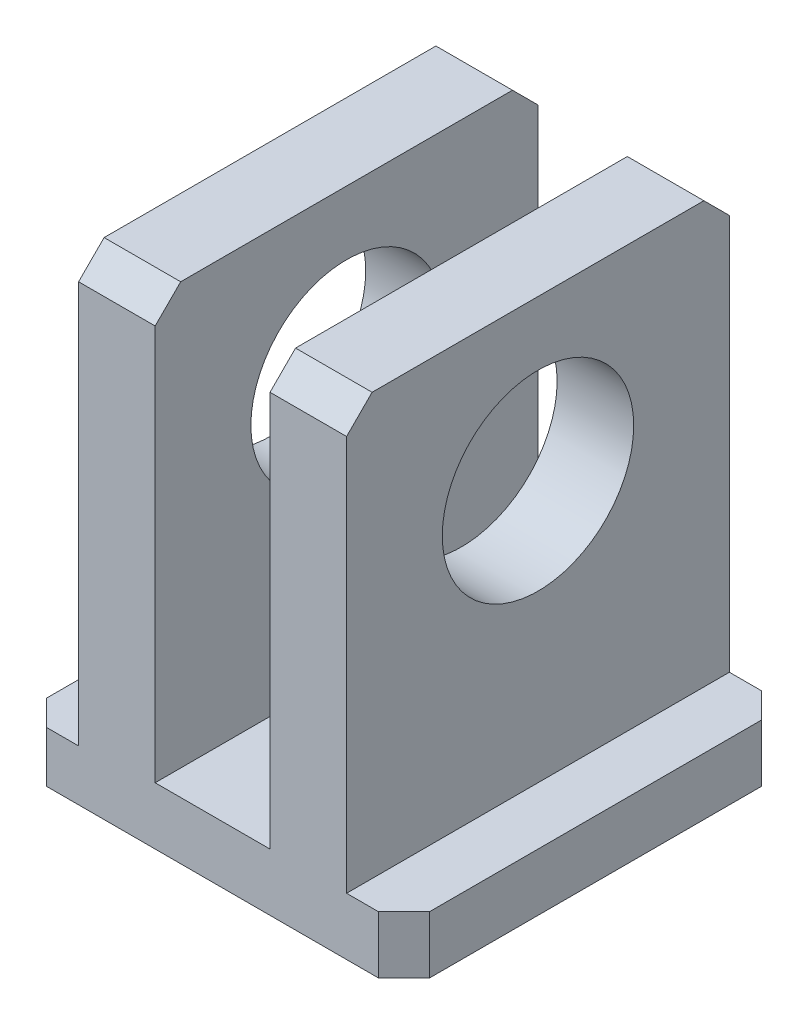
ISO-10303-21;
HEADER;
FILE_DESCRIPTION(('STEP AP214'),'2;1');
FILE_NAME('part.step','',(''),(''),'','','');
FILE_SCHEMA(('AUTOMOTIVE_DESIGN { 1 0 10303 214 1 1 1 1 }'));
ENDSEC;
DATA;
#1=APPLICATION_CONTEXT('core data for automotive mechanical design processes');
#2=APPLICATION_PROTOCOL_DEFINITION('international standard','automotive_design',2000,#1);
#3=PRODUCT_CONTEXT('',#1,'mechanical');
#4=PRODUCT('Part','Part','',(#3));
#5=PRODUCT_RELATED_PRODUCT_CATEGORY('part','',(#4));
#6=PRODUCT_DEFINITION_FORMATION('','',#4);
#7=PRODUCT_DEFINITION_CONTEXT('part definition',#1,'design');
#8=PRODUCT_DEFINITION('design','',#6,#7);
#9=PRODUCT_DEFINITION_SHAPE('','',#8);
#10=(LENGTH_UNIT() NAMED_UNIT(*) SI_UNIT(.MILLI.,.METRE.));
#11=(NAMED_UNIT(*) PLANE_ANGLE_UNIT() SI_UNIT($,.RADIAN.));
#12=(NAMED_UNIT(*) SI_UNIT($,.STERADIAN.) SOLID_ANGLE_UNIT());
#13=UNCERTAINTY_MEASURE_WITH_UNIT(LENGTH_MEASURE(1.E-05),#10,'distance_accuracy_value','');
#14=(GEOMETRIC_REPRESENTATION_CONTEXT(3) GLOBAL_UNCERTAINTY_ASSIGNED_CONTEXT((#13)) GLOBAL_UNIT_ASSIGNED_CONTEXT((#10,
#11,#12)) REPRESENTATION_CONTEXT('',''));
#15=CARTESIAN_POINT('',(0.,0.,0.));
#16=DIRECTION('',(0.,0.,1.));
#17=DIRECTION('',(1.,0.,0.));
#18=AXIS2_PLACEMENT_3D('',#15,#16,#17);
#19=CARTESIAN_POINT('',(-13.,37.5,15.));
#20=DIRECTION('',(0.,0.,-1.));
#21=DIRECTION('',(-1.,0.,0.));
#22=AXIS2_PLACEMENT_3D('',#19,#20,#21);
#23=PLANE('',#22);
#24=DIRECTION('',(0.,1.,0.));
#25=VECTOR('',#24,1.);
#26=CARTESIAN_POINT('',(10.5,4.5,15.));
#27=LINE('',#26,#25);
#28=CARTESIAN_POINT('',(10.5,4.5,15.));
#29=VERTEX_POINT('',#28);
#30=CARTESIAN_POINT('',(10.5,35.5,15.));
#31=VERTEX_POINT('',#30);
#32=EDGE_CURVE('E247',#29,#31,#27,.T.);
#33=ORIENTED_EDGE('',*,*,#32,.T.);
#34=DIRECTION('',(-1.,0.,0.));
#35=VECTOR('',#34,1.);
#36=CARTESIAN_POINT('',(-13.,35.5,15.));
#37=LINE('',#36,#35);
#38=CARTESIAN_POINT('',(4.5,35.5,15.));
#39=VERTEX_POINT('',#38);
#40=EDGE_CURVE('E328',#31,#39,#37,.T.);
#41=ORIENTED_EDGE('',*,*,#40,.T.);
#42=DIRECTION('',(0.,1.,0.));
#43=VECTOR('',#42,1.);
#44=CARTESIAN_POINT('',(4.5,4.5,15.));
#45=LINE('',#44,#43);
#46=CARTESIAN_POINT('',(4.5,4.5,15.));
#47=VERTEX_POINT('',#46);
#48=EDGE_CURVE('E206',#47,#39,#45,.T.);
#49=ORIENTED_EDGE('',*,*,#48,.F.);
#50=DIRECTION('',(-1.,0.,0.));
#51=VECTOR('',#50,1.);
#52=CARTESIAN_POINT('',(4.5,4.5,15.));
#53=LINE('',#52,#51);
#54=CARTESIAN_POINT('',(-4.5,4.5,15.));
#55=VERTEX_POINT('',#54);
#56=EDGE_CURVE('E185',#47,#55,#53,.T.);
#57=ORIENTED_EDGE('',*,*,#56,.T.);
#58=DIRECTION('',(0.,1.,0.));
#59=VECTOR('',#58,1.);
#60=CARTESIAN_POINT('',(-4.5,4.5,15.));
#61=LINE('',#60,#59);
#62=CARTESIAN_POINT('',(-4.5,35.5,15.));
#63=VERTEX_POINT('',#62);
#64=EDGE_CURVE('E194',#55,#63,#61,.T.);
#65=ORIENTED_EDGE('',*,*,#64,.T.);
#66=DIRECTION('',(-1.,0.,0.));
#67=VECTOR('',#66,1.);
#68=CARTESIAN_POINT('',(-13.,35.5,15.));
#69=LINE('',#68,#67);
#70=CARTESIAN_POINT('',(-10.5,35.5,15.));
#71=VERTEX_POINT('',#70);
#72=EDGE_CURVE('E326',#63,#71,#69,.T.);
#73=ORIENTED_EDGE('',*,*,#72,.T.);
#74=DIRECTION('',(0.,1.,0.));
#75=VECTOR('',#74,1.);
#76=CARTESIAN_POINT('',(-10.5,4.,15.));
#77=LINE('',#76,#75);
#78=CARTESIAN_POINT('',(-10.5,4.,15.));
#79=VERTEX_POINT('',#78);
#80=EDGE_CURVE('E267',#79,#71,#77,.T.);
#81=ORIENTED_EDGE('',*,*,#80,.F.);
#82=DIRECTION('',(1.,0.,0.));
#83=VECTOR('',#82,1.);
#84=CARTESIAN_POINT('',(-13.,4.,15.));
#85=LINE('',#84,#83);
#86=CARTESIAN_POINT('',(-13.,4.,15.));
#87=VERTEX_POINT('',#86);
#88=EDGE_CURVE('E264',#87,#79,#85,.T.);
#89=ORIENTED_EDGE('',*,*,#88,.F.);
#90=DIRECTION('',(0.,-1.,0.));
#91=VECTOR('',#90,1.);
#92=CARTESIAN_POINT('',(-13.,37.5,15.));
#93=LINE('',#92,#91);
#94=CARTESIAN_POINT('',(-13.,0.,15.));
#95=VERTEX_POINT('',#94);
#96=EDGE_CURVE('E303',#87,#95,#93,.T.);
#97=ORIENTED_EDGE('',*,*,#96,.T.);
#98=DIRECTION('',(1.,0.,0.));
#99=VECTOR('',#98,1.);
#100=CARTESIAN_POINT('',(-13.,0.,15.));
#101=LINE('',#100,#99);
#102=CARTESIAN_POINT('',(13.,0.,15.));
#103=VERTEX_POINT('',#102);
#104=EDGE_CURVE('E288',#95,#103,#101,.T.);
#105=ORIENTED_EDGE('',*,*,#104,.T.);
#106=DIRECTION('',(0.,-1.,0.));
#107=VECTOR('',#106,1.);
#108=CARTESIAN_POINT('',(13.,37.5,15.));
#109=LINE('',#108,#107);
#110=CARTESIAN_POINT('',(13.,4.5,15.));
#111=VERTEX_POINT('',#110);
#112=EDGE_CURVE('E305',#111,#103,#109,.T.);
#113=ORIENTED_EDGE('',*,*,#112,.F.);
#114=DIRECTION('',(-1.,0.,0.));
#115=VECTOR('',#114,1.);
#116=CARTESIAN_POINT('',(13.,4.5,15.));
#117=LINE('',#116,#115);
#118=EDGE_CURVE('E237',#111,#29,#117,.T.);
#119=ORIENTED_EDGE('',*,*,#118,.T.);
#120=EDGE_LOOP('',(#33,#41,#49,#57,#65,#73,#81,#89,#97,#105,#113,#119));
#121=FACE_BOUND('',#120,.T.);
#122=ADVANCED_FACE('F43',(#121),#23,.F.);
#123=CARTESIAN_POINT('',(-13.,37.5,-15.));
#124=DIRECTION('',(0.,0.,-1.));
#125=DIRECTION('',(-1.,0.,0.));
#126=AXIS2_PLACEMENT_3D('',#123,#124,#125);
#127=PLANE('',#126);
#128=DIRECTION('',(0.,1.,0.));
#129=VECTOR('',#128,1.);
#130=CARTESIAN_POINT('',(4.5,4.5,-15.));
#131=LINE('',#130,#129);
#132=CARTESIAN_POINT('',(4.5,4.5,-15.));
#133=VERTEX_POINT('',#132);
#134=CARTESIAN_POINT('',(4.5,35.5,-15.));
#135=VERTEX_POINT('',#134);
#136=EDGE_CURVE('E221',#133,#135,#131,.T.);
#137=ORIENTED_EDGE('',*,*,#136,.T.);
#138=DIRECTION('',(1.,0.,0.));
#139=VECTOR('',#138,1.);
#140=CARTESIAN_POINT('',(10.5,35.5,-15.));
#141=LINE('',#140,#139);
#142=CARTESIAN_POINT('',(10.5,35.5,-15.));
#143=VERTEX_POINT('',#142);
#144=EDGE_CURVE('E337',#135,#143,#141,.T.);
#145=ORIENTED_EDGE('',*,*,#144,.T.);
#146=DIRECTION('',(0.,1.,0.));
#147=VECTOR('',#146,1.);
#148=CARTESIAN_POINT('',(10.5,4.5,-15.));
#149=LINE('',#148,#147);
#150=CARTESIAN_POINT('',(10.5,4.5,-15.));
#151=VERTEX_POINT('',#150);
#152=EDGE_CURVE('E242',#151,#143,#149,.T.);
#153=ORIENTED_EDGE('',*,*,#152,.F.);
#154=DIRECTION('',(1.,0.,0.));
#155=VECTOR('',#154,1.);
#156=CARTESIAN_POINT('',(10.5,4.5,-15.));
#157=LINE('',#156,#155);
#158=CARTESIAN_POINT('',(13.,4.5,-15.));
#159=VERTEX_POINT('',#158);
#160=EDGE_CURVE('E225',#151,#159,#157,.T.);
#161=ORIENTED_EDGE('',*,*,#160,.T.);
#162=DIRECTION('',(0.,-1.,0.));
#163=VECTOR('',#162,1.);
#164=CARTESIAN_POINT('',(13.,37.5,-15.));
#165=LINE('',#164,#163);
#166=CARTESIAN_POINT('',(13.,0.,-15.));
#167=VERTEX_POINT('',#166);
#168=EDGE_CURVE('E311',#159,#167,#165,.T.);
#169=ORIENTED_EDGE('',*,*,#168,.T.);
#170=DIRECTION('',(1.,0.,0.));
#171=VECTOR('',#170,1.);
#172=CARTESIAN_POINT('',(-13.,0.,-15.));
#173=LINE('',#172,#171);
#174=CARTESIAN_POINT('',(-13.,0.,-15.));
#175=VERTEX_POINT('',#174);
#176=EDGE_CURVE('E276',#175,#167,#173,.T.);
#177=ORIENTED_EDGE('',*,*,#176,.F.);
#178=DIRECTION('',(0.,-1.,0.));
#179=VECTOR('',#178,1.);
#180=CARTESIAN_POINT('',(-13.,37.5,-15.));
#181=LINE('',#180,#179);
#182=CARTESIAN_POINT('',(-13.,4.,-15.));
#183=VERTEX_POINT('',#182);
#184=EDGE_CURVE('E297',#183,#175,#181,.T.);
#185=ORIENTED_EDGE('',*,*,#184,.F.);
#186=DIRECTION('',(1.,0.,0.));
#187=VECTOR('',#186,1.);
#188=CARTESIAN_POINT('',(-13.,4.,-15.));
#189=LINE('',#188,#187);
#190=CARTESIAN_POINT('',(-10.5,4.,-15.));
#191=VERTEX_POINT('',#190);
#192=EDGE_CURVE('E258',#183,#191,#189,.T.);
#193=ORIENTED_EDGE('',*,*,#192,.T.);
#194=DIRECTION('',(0.,1.,0.));
#195=VECTOR('',#194,1.);
#196=CARTESIAN_POINT('',(-10.5,4.,-15.));
#197=LINE('',#196,#195);
#198=CARTESIAN_POINT('',(-10.5,35.5,-15.));
#199=VERTEX_POINT('',#198);
#200=EDGE_CURVE('E270',#191,#199,#197,.T.);
#201=ORIENTED_EDGE('',*,*,#200,.T.);
#202=DIRECTION('',(1.,0.,0.));
#203=VECTOR('',#202,1.);
#204=CARTESIAN_POINT('',(-4.5,35.5,-15.));
#205=LINE('',#204,#203);
#206=CARTESIAN_POINT('',(-4.5,35.5,-15.));
#207=VERTEX_POINT('',#206);
#208=EDGE_CURVE('E334',#199,#207,#205,.T.);
#209=ORIENTED_EDGE('',*,*,#208,.T.);
#210=DIRECTION('',(0.,1.,0.));
#211=VECTOR('',#210,1.);
#212=CARTESIAN_POINT('',(-4.5,4.5,-15.));
#213=LINE('',#212,#211);
#214=CARTESIAN_POINT('',(-4.5,4.5,-15.));
#215=VERTEX_POINT('',#214);
#216=EDGE_CURVE('E201',#215,#207,#213,.T.);
#217=ORIENTED_EDGE('',*,*,#216,.F.);
#218=DIRECTION('',(-1.,0.,0.));
#219=VECTOR('',#218,1.);
#220=CARTESIAN_POINT('',(4.5,4.5,-15.));
#221=LINE('',#220,#219);
#222=EDGE_CURVE('E188',#133,#215,#221,.T.);
#223=ORIENTED_EDGE('',*,*,#222,.F.);
#224=EDGE_LOOP('',(#137,#145,#153,#161,#169,#177,#185,#193,#201,#209,#217,#223));
#225=FACE_BOUND('',#224,.T.);
#226=ADVANCED_FACE('F351',(#225),#127,.T.);
#227=CARTESIAN_POINT('',(0.,37.5,0.));
#228=DIRECTION('',(0.,-1.,0.));
#229=DIRECTION('',(0.,0.,-1.));
#230=AXIS2_PLACEMENT_3D('',#227,#228,#229);
#231=PLANE('',#230);
#232=DIRECTION('',(0.,0.,-1.));
#233=VECTOR('',#232,1.);
#234=CARTESIAN_POINT('',(-10.5,37.5,15.));
#235=LINE('',#234,#233);
#236=CARTESIAN_POINT('',(-10.5,37.5,13.));
#237=VERTEX_POINT('',#236);
#238=CARTESIAN_POINT('',(-10.5,37.5,-13.));
#239=VERTEX_POINT('',#238);
#240=EDGE_CURVE('E253',#237,#239,#235,.T.);
#241=ORIENTED_EDGE('',*,*,#240,.F.);
#242=DIRECTION('',(1.,0.,0.));
#243=VECTOR('',#242,1.);
#244=CARTESIAN_POINT('',(0.,37.5,13.));
#245=LINE('',#244,#243);
#246=CARTESIAN_POINT('',(-4.5,37.5,13.));
#247=VERTEX_POINT('',#246);
#248=EDGE_CURVE('E341',#237,#247,#245,.T.);
#249=ORIENTED_EDGE('',*,*,#248,.T.);
#250=DIRECTION('',(0.,0.,-1.));
#251=VECTOR('',#250,1.);
#252=CARTESIAN_POINT('',(-4.5,37.5,15.));
#253=LINE('',#252,#251);
#254=CARTESIAN_POINT('',(-4.5,37.5,-13.));
#255=VERTEX_POINT('',#254);
#256=EDGE_CURVE('E210',#247,#255,#253,.T.);
#257=ORIENTED_EDGE('',*,*,#256,.T.);
#258=DIRECTION('',(-1.,0.,0.));
#259=VECTOR('',#258,1.);
#260=CARTESIAN_POINT('',(-10.5,37.5,-13.));
#261=LINE('',#260,#259);
#262=EDGE_CURVE('E59',#255,#239,#261,.T.);
#263=ORIENTED_EDGE('',*,*,#262,.T.);
#264=EDGE_LOOP('',(#241,#249,#257,#263));
#265=FACE_BOUND('',#264,.T.);
#266=ADVANCED_FACE('F354',(#265),#231,.F.);
#267=DIRECTION('',(0.,0.,-1.));
#268=VECTOR('',#267,1.);
#269=CARTESIAN_POINT('',(4.5,37.5,15.));
#270=LINE('',#269,#268);
#271=CARTESIAN_POINT('',(4.5,37.5,13.));
#272=VERTEX_POINT('',#271);
#273=CARTESIAN_POINT('',(4.5,37.5,-13.));
#274=VERTEX_POINT('',#273);
#275=EDGE_CURVE('E207',#272,#274,#270,.T.);
#276=ORIENTED_EDGE('',*,*,#275,.F.);
#277=DIRECTION('',(1.,0.,0.));
#278=VECTOR('',#277,1.);
#279=CARTESIAN_POINT('',(0.,37.5,13.));
#280=LINE('',#279,#278);
#281=CARTESIAN_POINT('',(10.5,37.5,13.));
#282=VERTEX_POINT('',#281);
#283=EDGE_CURVE('E319',#272,#282,#280,.T.);
#284=ORIENTED_EDGE('',*,*,#283,.T.);
#285=DIRECTION('',(0.,0.,-1.));
#286=VECTOR('',#285,1.);
#287=CARTESIAN_POINT('',(10.5,37.5,15.));
#288=LINE('',#287,#286);
#289=CARTESIAN_POINT('',(10.5,37.5,-13.));
#290=VERTEX_POINT('',#289);
#291=EDGE_CURVE('E200',#282,#290,#288,.T.);
#292=ORIENTED_EDGE('',*,*,#291,.T.);
#293=DIRECTION('',(-1.,0.,0.));
#294=VECTOR('',#293,1.);
#295=CARTESIAN_POINT('',(4.5,37.5,-13.));
#296=LINE('',#295,#294);
#297=EDGE_CURVE('E300',#290,#274,#296,.T.);
#298=ORIENTED_EDGE('',*,*,#297,.T.);
#299=EDGE_LOOP('',(#276,#284,#292,#298));
#300=FACE_BOUND('',#299,.T.);
#301=ADVANCED_FACE('F404',(#300),#231,.F.);
#302=CARTESIAN_POINT('',(-15.,37.5,-13.));
#303=DIRECTION('',(-0.707106781186548,0.,-0.707106781186548));
#304=DIRECTION('',(-0.707106781186548,0.,0.707106781186548));
#305=AXIS2_PLACEMENT_3D('',#302,#303,#304);
#306=PLANE('',#305);
#307=DIRECTION('',(0.,-1.,0.));
#308=VECTOR('',#307,1.);
#309=CARTESIAN_POINT('',(-15.,37.5,-13.));
#310=LINE('',#309,#308);
#311=CARTESIAN_POINT('',(-15.,4.,-13.));
#312=VERTEX_POINT('',#311);
#313=CARTESIAN_POINT('',(-15.,0.,-13.));
#314=VERTEX_POINT('',#313);
#315=EDGE_CURVE('E298',#312,#314,#310,.T.);
#316=ORIENTED_EDGE('',*,*,#315,.F.);
#317=DIRECTION('',(0.707106781186548,0.,-0.707106781186548));
#318=VECTOR('',#317,1.);
#319=CARTESIAN_POINT('',(-13.,4.,-15.));
#320=LINE('',#319,#318);
#321=EDGE_CURVE('E249',#312,#183,#320,.T.);
#322=ORIENTED_EDGE('',*,*,#321,.T.);
#323=ORIENTED_EDGE('',*,*,#184,.T.);
#324=DIRECTION('',(0.707106781186548,0.,-0.707106781186548));
#325=VECTOR('',#324,1.);
#326=CARTESIAN_POINT('',(-15.,0.,-13.));
#327=LINE('',#326,#325);
#328=EDGE_CURVE('E273',#314,#175,#327,.T.);
#329=ORIENTED_EDGE('',*,*,#328,.F.);
#330=EDGE_LOOP('',(#316,#322,#323,#329));
#331=FACE_BOUND('',#330,.T.);
#332=ADVANCED_FACE('F433',(#331),#306,.T.);
#333=CARTESIAN_POINT('',(-15.,37.5,-13.));
#334=DIRECTION('',(1.,0.,0.));
#335=DIRECTION('',(0.,0.,-1.));
#336=AXIS2_PLACEMENT_3D('',#333,#334,#335);
#337=PLANE('',#336);
#338=DIRECTION('',(0.,-1.,0.));
#339=VECTOR('',#338,1.);
#340=CARTESIAN_POINT('',(-15.,37.5,13.));
#341=LINE('',#340,#339);
#342=CARTESIAN_POINT('',(-15.,4.,13.));
#343=VERTEX_POINT('',#342);
#344=CARTESIAN_POINT('',(-15.,0.,13.));
#345=VERTEX_POINT('',#344);
#346=EDGE_CURVE('E301',#343,#345,#341,.T.);
#347=ORIENTED_EDGE('',*,*,#346,.F.);
#348=DIRECTION('',(0.,0.,-1.));
#349=VECTOR('',#348,1.);
#350=CARTESIAN_POINT('',(-15.,4.,-13.));
#351=LINE('',#350,#349);
#352=EDGE_CURVE('E254',#343,#312,#351,.T.);
#353=ORIENTED_EDGE('',*,*,#352,.T.);
#354=ORIENTED_EDGE('',*,*,#315,.T.);
#355=DIRECTION('',(0.,0.,1.));
#356=VECTOR('',#355,1.);
#357=CARTESIAN_POINT('',(-15.,0.,-13.));
#358=LINE('',#357,#356);
#359=EDGE_CURVE('E294',#314,#345,#358,.T.);
#360=ORIENTED_EDGE('',*,*,#359,.T.);
#361=EDGE_LOOP('',(#347,#353,#354,#360));
#362=FACE_BOUND('',#361,.T.);
#363=ADVANCED_FACE('F435',(#362),#337,.F.);
#364=CARTESIAN_POINT('',(-15.,37.5,13.));
#365=DIRECTION('',(0.707106781186548,0.,-0.707106781186548));
#366=DIRECTION('',(-0.707106781186548,0.,-0.707106781186548));
#367=AXIS2_PLACEMENT_3D('',#364,#365,#366);
#368=PLANE('',#367);
#369=ORIENTED_EDGE('',*,*,#96,.F.);
#370=DIRECTION('',(-0.707106781186548,0.,-0.707106781186548));
#371=VECTOR('',#370,1.);
#372=CARTESIAN_POINT('',(-15.,4.,13.));
#373=LINE('',#372,#371);
#374=EDGE_CURVE('E250',#87,#343,#373,.T.);
#375=ORIENTED_EDGE('',*,*,#374,.T.);
#376=ORIENTED_EDGE('',*,*,#346,.T.);
#377=DIRECTION('',(0.707106781186548,0.,0.707106781186548));
#378=VECTOR('',#377,1.);
#379=CARTESIAN_POINT('',(-15.,0.,13.));
#380=LINE('',#379,#378);
#381=EDGE_CURVE('E291',#345,#95,#380,.T.);
#382=ORIENTED_EDGE('',*,*,#381,.T.);
#383=EDGE_LOOP('',(#369,#375,#376,#382));
#384=FACE_BOUND('',#383,.T.);
#385=ADVANCED_FACE('F364',(#384),#368,.F.);
#386=CARTESIAN_POINT('',(13.,37.5,15.));
#387=DIRECTION('',(-0.707106781186548,0.,-0.707106781186548));
#388=DIRECTION('',(-0.707106781186548,0.,0.707106781186548));
#389=AXIS2_PLACEMENT_3D('',#386,#387,#388);
#390=PLANE('',#389);
#391=DIRECTION('',(0.,-1.,0.));
#392=VECTOR('',#391,1.);
#393=CARTESIAN_POINT('',(15.,37.5,13.));
#394=LINE('',#393,#392);
#395=CARTESIAN_POINT('',(15.,4.5,13.));
#396=VERTEX_POINT('',#395);
#397=CARTESIAN_POINT('',(15.,0.,13.));
#398=VERTEX_POINT('',#397);
#399=EDGE_CURVE('E307',#396,#398,#394,.T.);
#400=ORIENTED_EDGE('',*,*,#399,.F.);
#401=DIRECTION('',(-0.707106781186547,0.,0.707106781186548));
#402=VECTOR('',#401,1.);
#403=CARTESIAN_POINT('',(15.,4.5,13.));
#404=LINE('',#403,#402);
#405=EDGE_CURVE('E234',#396,#111,#404,.T.);
#406=ORIENTED_EDGE('',*,*,#405,.T.);
#407=ORIENTED_EDGE('',*,*,#112,.T.);
#408=DIRECTION('',(0.707106781186548,0.,-0.707106781186548));
#409=VECTOR('',#408,1.);
#410=CARTESIAN_POINT('',(13.,0.,15.));
#411=LINE('',#410,#409);
#412=EDGE_CURVE('E285',#103,#398,#411,.T.);
#413=ORIENTED_EDGE('',*,*,#412,.T.);
#414=EDGE_LOOP('',(#400,#406,#407,#413));
#415=FACE_BOUND('',#414,.T.);
#416=ADVANCED_FACE('F375',(#415),#390,.F.);
#417=CARTESIAN_POINT('',(15.,37.5,-13.));
#418=DIRECTION('',(1.,0.,0.));
#419=DIRECTION('',(0.,0.,-1.));
#420=AXIS2_PLACEMENT_3D('',#417,#418,#419);
#421=PLANE('',#420);
#422=DIRECTION('',(0.,0.,1.));
#423=VECTOR('',#422,1.);
#424=CARTESIAN_POINT('',(15.,4.5,-13.));
#425=LINE('',#424,#423);
#426=CARTESIAN_POINT('',(15.,4.5,-13.));
#427=VERTEX_POINT('',#426);
#428=EDGE_CURVE('E231',#427,#396,#425,.T.);
#429=ORIENTED_EDGE('',*,*,#428,.T.);
#430=ORIENTED_EDGE('',*,*,#399,.T.);
#431=DIRECTION('',(0.,0.,1.));
#432=VECTOR('',#431,1.);
#433=CARTESIAN_POINT('',(15.,0.,-13.));
#434=LINE('',#433,#432);
#435=CARTESIAN_POINT('',(15.,0.,-13.));
#436=VERTEX_POINT('',#435);
#437=EDGE_CURVE('E282',#436,#398,#434,.T.);
#438=ORIENTED_EDGE('',*,*,#437,.F.);
#439=DIRECTION('',(0.,-1.,0.));
#440=VECTOR('',#439,1.);
#441=CARTESIAN_POINT('',(15.,37.5,-13.));
#442=LINE('',#441,#440);
#443=EDGE_CURVE('E309',#427,#436,#442,.T.);
#444=ORIENTED_EDGE('',*,*,#443,.F.);
#445=EDGE_LOOP('',(#429,#430,#438,#444));
#446=FACE_BOUND('',#445,.T.);
#447=ADVANCED_FACE('F382',(#446),#421,.T.);
#448=CARTESIAN_POINT('',(13.,37.5,-15.));
#449=DIRECTION('',(0.707106781186548,0.,-0.707106781186548));
#450=DIRECTION('',(-0.707106781186548,0.,-0.707106781186548));
#451=AXIS2_PLACEMENT_3D('',#448,#449,#450);
#452=PLANE('',#451);
#453=DIRECTION('',(0.707106781186548,0.,0.707106781186548));
#454=VECTOR('',#453,1.);
#455=CARTESIAN_POINT('',(13.,4.5,-15.));
#456=LINE('',#455,#454);
#457=EDGE_CURVE('E228',#159,#427,#456,.T.);
#458=ORIENTED_EDGE('',*,*,#457,.T.);
#459=ORIENTED_EDGE('',*,*,#443,.T.);
#460=DIRECTION('',(0.707106781186548,0.,0.707106781186548));
#461=VECTOR('',#460,1.);
#462=CARTESIAN_POINT('',(13.,0.,-15.));
#463=LINE('',#462,#461);
#464=EDGE_CURVE('E279',#167,#436,#463,.T.);
#465=ORIENTED_EDGE('',*,*,#464,.F.);
#466=ORIENTED_EDGE('',*,*,#168,.F.);
#467=EDGE_LOOP('',(#458,#459,#465,#466));
#468=FACE_BOUND('',#467,.T.);
#469=ADVANCED_FACE('F386',(#468),#452,.T.);
#470=CARTESIAN_POINT('',(0.,0.,0.));
#471=DIRECTION('',(0.,-1.,0.));
#472=DIRECTION('',(0.,0.,-1.));
#473=AXIS2_PLACEMENT_3D('',#470,#471,#472);
#474=PLANE('',#473);
#475=ORIENTED_EDGE('',*,*,#328,.T.);
#476=ORIENTED_EDGE('',*,*,#176,.T.);
#477=ORIENTED_EDGE('',*,*,#464,.T.);
#478=ORIENTED_EDGE('',*,*,#437,.T.);
#479=ORIENTED_EDGE('',*,*,#412,.F.);
#480=ORIENTED_EDGE('',*,*,#104,.F.);
#481=ORIENTED_EDGE('',*,*,#381,.F.);
#482=ORIENTED_EDGE('',*,*,#359,.F.);
#483=EDGE_LOOP('',(#475,#476,#477,#478,#479,#480,#481,#482));
#484=FACE_BOUND('',#483,.T.);
#485=ADVANCED_FACE('F371',(#484),#474,.T.);
#486=CARTESIAN_POINT('',(-10.5,4.,15.));
#487=DIRECTION('',(1.,0.,0.));
#488=DIRECTION('',(0.,0.,-1.));
#489=AXIS2_PLACEMENT_3D('',#486,#487,#488);
#490=PLANE('',#489);
#491=CARTESIAN_POINT('',(-10.5,25.,0.));
#492=DIRECTION('',(-1.,0.,0.));
#493=DIRECTION('',(0.,0.,1.));
#494=AXIS2_PLACEMENT_3D('',#491,#492,#493);
#495=CIRCLE('',#494,7.5);
#496=CARTESIAN_POINT('',(-10.5,25.,7.5));
#497=VERTEX_POINT('',#496);
#498=EDGE_CURVE('E472',#497,#497,#495,.T.);
#499=ORIENTED_EDGE('',*,*,#498,.F.);
#500=EDGE_LOOP('',(#499));
#501=FACE_BOUND('',#500,.T.);
#502=ORIENTED_EDGE('',*,*,#80,.T.);
#503=DIRECTION('',(0.,-0.707106781186549,0.707106781186546));
#504=VECTOR('',#503,1.);
#505=CARTESIAN_POINT('',(-10.5,37.5,13.));
#506=LINE('',#505,#504);
#507=EDGE_CURVE('E11',#71,#237,#506,.F.);
#508=ORIENTED_EDGE('',*,*,#507,.T.);
#509=ORIENTED_EDGE('',*,*,#240,.T.);
#510=DIRECTION('',(0.,-0.707106781186546,-0.707106781186549));
#511=VECTOR('',#510,1.);
#512=CARTESIAN_POINT('',(-10.5,35.5,-15.));
#513=LINE('',#512,#511);
#514=EDGE_CURVE('E52',#239,#199,#513,.T.);
#515=ORIENTED_EDGE('',*,*,#514,.T.);
#516=ORIENTED_EDGE('',*,*,#200,.F.);
#517=DIRECTION('',(0.,0.,-1.));
#518=VECTOR('',#517,1.);
#519=CARTESIAN_POINT('',(-10.5,4.,15.));
#520=LINE('',#519,#518);
#521=EDGE_CURVE('E261',#79,#191,#520,.T.);
#522=ORIENTED_EDGE('',*,*,#521,.F.);
#523=EDGE_LOOP('',(#502,#508,#509,#515,#516,#522));
#524=FACE_BOUND('',#523,.T.);
#525=ADVANCED_FACE('F347',(#501,#524),#490,.F.);
#526=CARTESIAN_POINT('',(0.,4.,0.));
#527=DIRECTION('',(0.,-1.,0.));
#528=DIRECTION('',(0.,0.,-1.));
#529=AXIS2_PLACEMENT_3D('',#526,#527,#528);
#530=PLANE('',#529);
#531=ORIENTED_EDGE('',*,*,#192,.F.);
#532=ORIENTED_EDGE('',*,*,#321,.F.);
#533=ORIENTED_EDGE('',*,*,#352,.F.);
#534=ORIENTED_EDGE('',*,*,#374,.F.);
#535=ORIENTED_EDGE('',*,*,#88,.T.);
#536=ORIENTED_EDGE('',*,*,#521,.T.);
#537=EDGE_LOOP('',(#531,#532,#533,#534,#535,#536));
#538=FACE_BOUND('',#537,.T.);
#539=ADVANCED_FACE('F361',(#538),#530,.F.);
#540=CARTESIAN_POINT('',(10.5,4.5,15.));
#541=DIRECTION('',(1.,0.,0.));
#542=DIRECTION('',(0.,0.,-1.));
#543=AXIS2_PLACEMENT_3D('',#540,#541,#542);
#544=PLANE('',#543);
#545=CARTESIAN_POINT('',(10.5,25.,0.));
#546=DIRECTION('',(1.,0.,0.));
#547=DIRECTION('',(0.,0.,-1.));
#548=AXIS2_PLACEMENT_3D('',#545,#546,#547);
#549=CIRCLE('',#548,7.5);
#550=CARTESIAN_POINT('',(10.5,25.,7.5));
#551=VERTEX_POINT('',#550);
#552=EDGE_CURVE('E317',#551,#551,#549,.F.);
#553=ORIENTED_EDGE('',*,*,#552,.T.);
#554=EDGE_LOOP('',(#553));
#555=FACE_BOUND('',#554,.T.);
#556=ORIENTED_EDGE('',*,*,#291,.F.);
#557=DIRECTION('',(0.,0.707106781186549,-0.707106781186546));
#558=VECTOR('',#557,1.);
#559=CARTESIAN_POINT('',(10.5,19.9999999999999,30.5));
#560=LINE('',#559,#558);
#561=EDGE_CURVE('E324',#282,#31,#560,.F.);
#562=ORIENTED_EDGE('',*,*,#561,.T.);
#563=ORIENTED_EDGE('',*,*,#32,.F.);
#564=DIRECTION('',(0.,0.,-1.));
#565=VECTOR('',#564,1.);
#566=CARTESIAN_POINT('',(10.5,4.5,15.));
#567=LINE('',#566,#565);
#568=EDGE_CURVE('E240',#29,#151,#567,.T.);
#569=ORIENTED_EDGE('',*,*,#568,.T.);
#570=ORIENTED_EDGE('',*,*,#152,.T.);
#571=DIRECTION('',(0.,0.707106781186546,0.707106781186549));
#572=VECTOR('',#571,1.);
#573=CARTESIAN_POINT('',(10.5,35.,-15.5));
#574=LINE('',#573,#572);
#575=EDGE_CURVE('E322',#143,#290,#574,.T.);
#576=ORIENTED_EDGE('',*,*,#575,.T.);
#577=EDGE_LOOP('',(#556,#562,#563,#569,#570,#576));
#578=FACE_BOUND('',#577,.T.);
#579=ADVANCED_FACE('F393',(#555,#578),#544,.T.);
#580=CARTESIAN_POINT('',(0.,4.5,0.));
#581=DIRECTION('',(0.,-1.,0.));
#582=DIRECTION('',(0.,0.,-1.));
#583=AXIS2_PLACEMENT_3D('',#580,#581,#582);
#584=PLANE('',#583);
#585=ORIENTED_EDGE('',*,*,#160,.F.);
#586=ORIENTED_EDGE('',*,*,#568,.F.);
#587=ORIENTED_EDGE('',*,*,#118,.F.);
#588=ORIENTED_EDGE('',*,*,#405,.F.);
#589=ORIENTED_EDGE('',*,*,#428,.F.);
#590=ORIENTED_EDGE('',*,*,#457,.F.);
#591=EDGE_LOOP('',(#585,#586,#587,#588,#589,#590));
#592=FACE_BOUND('',#591,.T.);
#593=ADVANCED_FACE('F378',(#592),#584,.F.);
#594=CARTESIAN_POINT('',(-4.5,4.5,15.));
#595=DIRECTION('',(1.,0.,0.));
#596=DIRECTION('',(0.,0.,-1.));
#597=AXIS2_PLACEMENT_3D('',#594,#595,#596);
#598=PLANE('',#597);
#599=CARTESIAN_POINT('',(-4.5,25.,0.));
#600=DIRECTION('',(1.,0.,0.));
#601=DIRECTION('',(0.,0.,-1.));
#602=AXIS2_PLACEMENT_3D('',#599,#600,#601);
#603=CIRCLE('',#602,7.5);
#604=CARTESIAN_POINT('',(-4.5,25.,7.5));
#605=VERTEX_POINT('',#604);
#606=EDGE_CURVE('E213',#605,#605,#603,.T.);
#607=ORIENTED_EDGE('',*,*,#606,.F.);
#608=EDGE_LOOP('',(#607));
#609=FACE_BOUND('',#608,.T.);
#610=ORIENTED_EDGE('',*,*,#256,.F.);
#611=DIRECTION('',(0.,0.707106781186549,-0.707106781186546));
#612=VECTOR('',#611,1.);
#613=CARTESIAN_POINT('',(-4.5,19.9999999999999,30.5));
#614=LINE('',#613,#612);
#615=EDGE_CURVE('E197',#247,#63,#614,.F.);
#616=ORIENTED_EDGE('',*,*,#615,.T.);
#617=ORIENTED_EDGE('',*,*,#64,.F.);
#618=DIRECTION('',(0.,0.,-1.));
#619=VECTOR('',#618,1.);
#620=CARTESIAN_POINT('',(-4.5,4.5,15.));
#621=LINE('',#620,#619);
#622=EDGE_CURVE('E180',#55,#215,#621,.T.);
#623=ORIENTED_EDGE('',*,*,#622,.T.);
#624=ORIENTED_EDGE('',*,*,#216,.T.);
#625=DIRECTION('',(0.,0.707106781186546,0.707106781186549));
#626=VECTOR('',#625,1.);
#627=CARTESIAN_POINT('',(-4.5,35.,-15.4999999999999));
#628=LINE('',#627,#626);
#629=EDGE_CURVE('E344',#207,#255,#628,.T.);
#630=ORIENTED_EDGE('',*,*,#629,.T.);
#631=EDGE_LOOP('',(#610,#616,#617,#623,#624,#630));
#632=FACE_BOUND('',#631,.T.);
#633=ADVANCED_FACE('F196',(#609,#632),#598,.T.);
#634=CARTESIAN_POINT('',(4.5,4.5,15.));
#635=DIRECTION('',(1.,0.,0.));
#636=DIRECTION('',(0.,0.,-1.));
#637=AXIS2_PLACEMENT_3D('',#634,#635,#636);
#638=PLANE('',#637);
#639=CARTESIAN_POINT('',(4.5,25.,0.));
#640=DIRECTION('',(1.,0.,0.));
#641=DIRECTION('',(0.,0.,-1.));
#642=AXIS2_PLACEMENT_3D('',#639,#640,#641);
#643=CIRCLE('',#642,7.5);
#644=CARTESIAN_POINT('',(4.5,25.,7.5));
#645=VERTEX_POINT('',#644);
#646=EDGE_CURVE('E314',#645,#645,#643,.T.);
#647=ORIENTED_EDGE('',*,*,#646,.T.);
#648=EDGE_LOOP('',(#647));
#649=FACE_BOUND('',#648,.T.);
#650=ORIENTED_EDGE('',*,*,#48,.T.);
#651=DIRECTION('',(0.,-0.707106781186549,0.707106781186546));
#652=VECTOR('',#651,1.);
#653=CARTESIAN_POINT('',(4.5,37.5,13.));
#654=LINE('',#653,#652);
#655=EDGE_CURVE('E332',#39,#272,#654,.F.);
#656=ORIENTED_EDGE('',*,*,#655,.T.);
#657=ORIENTED_EDGE('',*,*,#275,.T.);
#658=DIRECTION('',(0.,-0.707106781186546,-0.707106781186549));
#659=VECTOR('',#658,1.);
#660=CARTESIAN_POINT('',(4.5,35.5,-15.));
#661=LINE('',#660,#659);
#662=EDGE_CURVE('E330',#274,#135,#661,.T.);
#663=ORIENTED_EDGE('',*,*,#662,.T.);
#664=ORIENTED_EDGE('',*,*,#136,.F.);
#665=DIRECTION('',(0.,0.,-1.));
#666=VECTOR('',#665,1.);
#667=CARTESIAN_POINT('',(4.5,4.5,15.));
#668=LINE('',#667,#666);
#669=EDGE_CURVE('E217',#47,#133,#668,.T.);
#670=ORIENTED_EDGE('',*,*,#669,.F.);
#671=EDGE_LOOP('',(#650,#656,#657,#663,#664,#670));
#672=FACE_BOUND('',#671,.T.);
#673=ADVANCED_FACE('F401',(#649,#672),#638,.F.);
#674=CARTESIAN_POINT('',(0.,4.5,0.));
#675=DIRECTION('',(0.,-1.,0.));
#676=DIRECTION('',(0.,0.,-1.));
#677=AXIS2_PLACEMENT_3D('',#674,#675,#676);
#678=PLANE('',#677);
#679=ORIENTED_EDGE('',*,*,#56,.F.);
#680=ORIENTED_EDGE('',*,*,#669,.T.);
#681=ORIENTED_EDGE('',*,*,#222,.T.);
#682=ORIENTED_EDGE('',*,*,#622,.F.);
#683=EDGE_LOOP('',(#679,#680,#681,#682));
#684=FACE_BOUND('',#683,.T.);
#685=ADVANCED_FACE('F182',(#684),#678,.F.);
#686=CARTESIAN_POINT('',(31.7132034355964,25.,0.));
#687=DIRECTION('',(-1.,0.,0.));
#688=DIRECTION('',(0.,0.,1.));
#689=AXIS2_PLACEMENT_3D('',#686,#687,#688);
#690=CYLINDRICAL_SURFACE('',#689,7.5);
#691=CARTESIAN_POINT('',(10.5,25.,7.5));
#692=CARTESIAN_POINT('',(10.4375,25.,7.5));
#693=CARTESIAN_POINT('',(10.375,25.,7.5));
#694=CARTESIAN_POINT('',(10.25,25.,7.5));
#695=CARTESIAN_POINT('',(10.1875,25.,7.5));
#696=CARTESIAN_POINT('',(10.0625,25.,7.5));
#697=CARTESIAN_POINT('',(9.99999999999999,25.,7.5));
#698=CARTESIAN_POINT('',(9.87499999999999,25.,7.5));
#699=CARTESIAN_POINT('',(9.81249999999999,25.,7.5));
#700=CARTESIAN_POINT('',(9.68749999999999,25.,7.5));
#701=CARTESIAN_POINT('',(9.62499999999999,25.,7.5));
#702=CARTESIAN_POINT('',(9.49999999999999,25.,7.5));
#703=CARTESIAN_POINT('',(9.43749999999999,25.,7.5));
#704=CARTESIAN_POINT('',(9.31249999999999,25.,7.5));
#705=CARTESIAN_POINT('',(9.24999999999999,25.,7.5));
#706=CARTESIAN_POINT('',(9.12499999999999,25.,7.5));
#707=CARTESIAN_POINT('',(9.06249999999999,25.,7.5));
#708=CARTESIAN_POINT('',(8.93749999999999,25.,7.5));
#709=CARTESIAN_POINT('',(8.87499999999999,25.,7.5));
#710=CARTESIAN_POINT('',(8.74999999999999,25.,7.5));
#711=CARTESIAN_POINT('',(8.68749999999999,25.,7.5));
#712=CARTESIAN_POINT('',(8.56249999999999,25.,7.5));
#713=CARTESIAN_POINT('',(8.49999999999999,25.,7.5));
#714=CARTESIAN_POINT('',(8.37499999999999,25.,7.5));
#715=CARTESIAN_POINT('',(8.31249999999999,25.,7.5));
#716=CARTESIAN_POINT('',(8.1875,25.,7.5));
#717=CARTESIAN_POINT('',(8.125,25.,7.5));
#718=CARTESIAN_POINT('',(8.,25.,7.5));
#719=CARTESIAN_POINT('',(7.9375,25.,7.5));
#720=CARTESIAN_POINT('',(7.8125,25.,7.5));
#721=CARTESIAN_POINT('',(7.75,25.,7.5));
#722=CARTESIAN_POINT('',(7.625,25.,7.5));
#723=CARTESIAN_POINT('',(7.5625,25.,7.5));
#724=CARTESIAN_POINT('',(7.4375,25.,7.5));
#725=CARTESIAN_POINT('',(7.375,25.,7.5));
#726=CARTESIAN_POINT('',(7.25,25.,7.5));
#727=CARTESIAN_POINT('',(7.1875,25.,7.5));
#728=CARTESIAN_POINT('',(7.0625,25.,7.5));
#729=CARTESIAN_POINT('',(7.,25.,7.5));
#730=CARTESIAN_POINT('',(6.875,25.,7.5));
#731=CARTESIAN_POINT('',(6.8125,25.,7.5));
#732=CARTESIAN_POINT('',(6.6875,25.,7.5));
#733=CARTESIAN_POINT('',(6.625,25.,7.5));
#734=CARTESIAN_POINT('',(6.5,25.,7.5));
#735=CARTESIAN_POINT('',(6.4375,25.,7.5));
#736=CARTESIAN_POINT('',(6.3125,25.,7.5));
#737=CARTESIAN_POINT('',(6.25,25.,7.5));
#738=CARTESIAN_POINT('',(6.125,25.,7.5));
#739=CARTESIAN_POINT('',(6.0625,25.,7.5));
#740=CARTESIAN_POINT('',(5.9375,25.,7.5));
#741=CARTESIAN_POINT('',(5.875,25.,7.5));
#742=CARTESIAN_POINT('',(5.75,25.,7.5));
#743=CARTESIAN_POINT('',(5.6875,25.,7.5));
#744=CARTESIAN_POINT('',(5.5625,25.,7.5));
#745=CARTESIAN_POINT('',(5.5,25.,7.5));
#746=CARTESIAN_POINT('',(5.375,25.,7.5));
#747=CARTESIAN_POINT('',(5.3125,25.,7.5));
#748=CARTESIAN_POINT('',(5.1875,25.,7.5));
#749=CARTESIAN_POINT('',(5.125,25.,7.5));
#750=CARTESIAN_POINT('',(5.,25.,7.5));
#751=CARTESIAN_POINT('',(4.9375,25.,7.5));
#752=CARTESIAN_POINT('',(4.8125,25.,7.5));
#753=CARTESIAN_POINT('',(4.75,25.,7.5));
#754=CARTESIAN_POINT('',(4.625,25.,7.5));
#755=CARTESIAN_POINT('',(4.5625,25.,7.5));
#756=CARTESIAN_POINT('',(4.5,25.,7.5));
#757=B_SPLINE_CURVE_WITH_KNOTS('',3,(#691,#692,#693,#694,#695,#696,#697,#698,#699,#700,#701,
#702,#703,#704,#705,#706,#707,#708,#709,#710,#711,#712,#713,#714,#715,#716,#717,#718,#719,#720,
#721,#722,#723,#724,#725,#726,#727,#728,#729,#730,#731,#732,#733,#734,#735,#736,#737,#738,#739,
#740,#741,#742,#743,#744,#745,#746,#747,#748,#749,#750,#751,#752,#753,#754,#755,#756),
.UNSPECIFIED.,.F.,.F.,(4,2,2,2,2,2,2,2,2,2,2,2,2,2,2,2,2,2,2,2,2,2,2,2,2,2,2,2,2,2,2,2,4),(0.,
0.1875,0.375,0.5625,0.750000000000001,0.937499999999997,1.125,1.3125,1.5,1.6875,1.875,2.0625,
2.25,2.4375,2.625,2.8125,3.,3.1875,3.375,3.5625,3.75,3.9375,4.12499999999999,4.31249999999999,
4.49999999999999,4.68749999999999,4.87499999999999,5.06249999999999,5.24999999999999,
5.43749999999999,5.62499999999999,5.81249999999999,5.99999999999999),.UNSPECIFIED.);
#758=EDGE_CURVE('BSEAM479',#551,#645,#757,.T.);
#759=ORIENTED_EDGE('',*,*,#552,.F.);
#760=ORIENTED_EDGE('',*,*,#646,.F.);
#761=ORIENTED_EDGE('',*,*,#758,.T.);
#762=ORIENTED_EDGE('',*,*,#758,.F.);
#763=EDGE_LOOP('',(#759,#761,#760,#762));
#764=FACE_BOUND('',#763,.T.);
#765=ADVANCED_FACE('F479',(#764),#690,.F.);
#766=CARTESIAN_POINT('',(-4.5,25.,7.5));
#767=CARTESIAN_POINT('',(-4.5625,25.,7.5));
#768=CARTESIAN_POINT('',(-4.625,25.,7.5));
#769=CARTESIAN_POINT('',(-4.75,25.,7.5));
#770=CARTESIAN_POINT('',(-4.8125,25.,7.5));
#771=CARTESIAN_POINT('',(-4.9375,25.,7.5));
#772=CARTESIAN_POINT('',(-5.,25.,7.5));
#773=CARTESIAN_POINT('',(-5.125,25.,7.5));
#774=CARTESIAN_POINT('',(-5.1875,25.,7.5));
#775=CARTESIAN_POINT('',(-5.3125,25.,7.5));
#776=CARTESIAN_POINT('',(-5.375,25.,7.5));
#777=CARTESIAN_POINT('',(-5.5,25.,7.5));
#778=CARTESIAN_POINT('',(-5.5625,25.,7.5));
#779=CARTESIAN_POINT('',(-5.6875,25.,7.5));
#780=CARTESIAN_POINT('',(-5.75,25.,7.5));
#781=CARTESIAN_POINT('',(-5.875,25.,7.5));
#782=CARTESIAN_POINT('',(-5.9375,25.,7.5));
#783=CARTESIAN_POINT('',(-6.0625,25.,7.5));
#784=CARTESIAN_POINT('',(-6.12499999999999,25.,7.5));
#785=CARTESIAN_POINT('',(-6.24999999999999,25.,7.5));
#786=CARTESIAN_POINT('',(-6.31249999999999,25.,7.5));
#787=CARTESIAN_POINT('',(-6.43749999999999,25.,7.5));
#788=CARTESIAN_POINT('',(-6.49999999999999,25.,7.5));
#789=CARTESIAN_POINT('',(-6.62499999999999,25.,7.5));
#790=CARTESIAN_POINT('',(-6.68749999999999,25.,7.5));
#791=CARTESIAN_POINT('',(-6.81249999999999,25.,7.5));
#792=CARTESIAN_POINT('',(-6.87499999999999,25.,7.5));
#793=CARTESIAN_POINT('',(-6.99999999999999,25.,7.5));
#794=CARTESIAN_POINT('',(-7.06249999999999,25.,7.5));
#795=CARTESIAN_POINT('',(-7.18749999999999,25.,7.5));
#796=CARTESIAN_POINT('',(-7.24999999999999,25.,7.5));
#797=CARTESIAN_POINT('',(-7.37499999999999,25.,7.5));
#798=CARTESIAN_POINT('',(-7.43749999999999,25.,7.5));
#799=CARTESIAN_POINT('',(-7.56249999999999,25.,7.5));
#800=CARTESIAN_POINT('',(-7.62499999999999,25.,7.5));
#801=CARTESIAN_POINT('',(-7.74999999999999,25.,7.5));
#802=CARTESIAN_POINT('',(-7.81249999999999,25.,7.5));
#803=CARTESIAN_POINT('',(-7.93749999999999,25.,7.5));
#804=CARTESIAN_POINT('',(-7.99999999999999,25.,7.5));
#805=CARTESIAN_POINT('',(-8.12499999999999,25.,7.5));
#806=CARTESIAN_POINT('',(-8.18749999999999,25.,7.5));
#807=CARTESIAN_POINT('',(-8.31249999999999,25.,7.5));
#808=CARTESIAN_POINT('',(-8.37499999999999,25.,7.5));
#809=CARTESIAN_POINT('',(-8.49999999999999,25.,7.5));
#810=CARTESIAN_POINT('',(-8.56249999999999,25.,7.5));
#811=CARTESIAN_POINT('',(-8.68749999999999,25.,7.5));
#812=CARTESIAN_POINT('',(-8.74999999999999,25.,7.5));
#813=CARTESIAN_POINT('',(-8.87499999999999,25.,7.5));
#814=CARTESIAN_POINT('',(-8.93749999999999,25.,7.5));
#815=CARTESIAN_POINT('',(-9.06249999999999,25.,7.5));
#816=CARTESIAN_POINT('',(-9.12499999999999,25.,7.5));
#817=CARTESIAN_POINT('',(-9.24999999999999,25.,7.5));
#818=CARTESIAN_POINT('',(-9.31249999999999,25.,7.5));
#819=CARTESIAN_POINT('',(-9.43749999999999,25.,7.5));
#820=CARTESIAN_POINT('',(-9.49999999999999,25.,7.5));
#821=CARTESIAN_POINT('',(-9.62499999999999,25.,7.5));
#822=CARTESIAN_POINT('',(-9.68749999999999,25.,7.5));
#823=CARTESIAN_POINT('',(-9.81249999999999,25.,7.5));
#824=CARTESIAN_POINT('',(-9.87499999999999,25.,7.5));
#825=CARTESIAN_POINT('',(-9.99999999999999,25.,7.5));
#826=CARTESIAN_POINT('',(-10.0625,25.,7.5));
#827=CARTESIAN_POINT('',(-10.1875,25.,7.5));
#828=CARTESIAN_POINT('',(-10.25,25.,7.5));
#829=CARTESIAN_POINT('',(-10.375,25.,7.5));
#830=CARTESIAN_POINT('',(-10.4375,25.,7.5));
#831=CARTESIAN_POINT('',(-10.5,25.,7.5));
#832=B_SPLINE_CURVE_WITH_KNOTS('',3,(#766,#767,#768,#769,#770,#771,#772,#773,#774,#775,#776,
#777,#778,#779,#780,#781,#782,#783,#784,#785,#786,#787,#788,#789,#790,#791,#792,#793,#794,#795,
#796,#797,#798,#799,#800,#801,#802,#803,#804,#805,#806,#807,#808,#809,#810,#811,#812,#813,#814,
#815,#816,#817,#818,#819,#820,#821,#822,#823,#824,#825,#826,#827,#828,#829,#830,#831),
.UNSPECIFIED.,.F.,.F.,(4,2,2,2,2,2,2,2,2,2,2,2,2,2,2,2,2,2,2,2,2,2,2,2,2,2,2,2,2,2,2,2,4),(0.,
0.1875,0.375,0.5625,0.750000000000001,0.937500000000001,1.125,1.3125,1.5,1.68749999999999,
1.87499999999999,2.06249999999999,2.25,2.4375,2.625,2.8125,3.,3.1875,3.375,3.5625,3.75,3.9375,
4.125,4.3125,4.49999999999999,4.6875,4.87499999999999,5.06249999999999,5.24999999999999,
5.43749999999999,5.62499999999999,5.81249999999999,5.99999999999999),.UNSPECIFIED.);
#833=EDGE_CURVE('BSEAM414',#605,#497,#832,.T.);
#834=ORIENTED_EDGE('',*,*,#606,.T.);
#835=ORIENTED_EDGE('',*,*,#498,.T.);
#836=ORIENTED_EDGE('',*,*,#833,.T.);
#837=ORIENTED_EDGE('',*,*,#833,.F.);
#838=EDGE_LOOP('',(#834,#836,#835,#837));
#839=FACE_BOUND('',#838,.T.);
#840=ADVANCED_FACE('F414',(#839),#690,.F.);
#841=CARTESIAN_POINT('',(0.,37.5,13.));
#842=DIRECTION('',(0.,-0.707106781186546,-0.707106781186549));
#843=DIRECTION('',(1.,0.,0.));
#844=AXIS2_PLACEMENT_3D('',#841,#842,#843);
#845=PLANE('',#844);
#846=ORIENTED_EDGE('',*,*,#655,.F.);
#847=ORIENTED_EDGE('',*,*,#40,.F.);
#848=ORIENTED_EDGE('',*,*,#561,.F.);
#849=ORIENTED_EDGE('',*,*,#283,.F.);
#850=EDGE_LOOP('',(#846,#847,#848,#849));
#851=FACE_BOUND('',#850,.T.);
#852=ADVANCED_FACE('F397',(#851),#845,.F.);
#853=CARTESIAN_POINT('',(-13.,35.5,-15.));
#854=DIRECTION('',(0.,0.707106781186549,-0.707106781186546));
#855=DIRECTION('',(-1.,0.,0.));
#856=AXIS2_PLACEMENT_3D('',#853,#854,#855);
#857=PLANE('',#856);
#858=ORIENTED_EDGE('',*,*,#662,.F.);
#859=ORIENTED_EDGE('',*,*,#297,.F.);
#860=ORIENTED_EDGE('',*,*,#575,.F.);
#861=ORIENTED_EDGE('',*,*,#144,.F.);
#862=EDGE_LOOP('',(#858,#859,#860,#861));
#863=FACE_BOUND('',#862,.T.);
#864=ADVANCED_FACE('F407',(#863),#857,.T.);
#865=CARTESIAN_POINT('',(0.,37.5,13.));
#866=DIRECTION('',(0.,-0.707106781186546,-0.707106781186549));
#867=DIRECTION('',(1.,0.,0.));
#868=AXIS2_PLACEMENT_3D('',#865,#866,#867);
#869=PLANE('',#868);
#870=ORIENTED_EDGE('',*,*,#507,.F.);
#871=ORIENTED_EDGE('',*,*,#72,.F.);
#872=ORIENTED_EDGE('',*,*,#615,.F.);
#873=ORIENTED_EDGE('',*,*,#248,.F.);
#874=EDGE_LOOP('',(#870,#871,#872,#873));
#875=FACE_BOUND('',#874,.T.);
#876=ADVANCED_FACE('F357',(#875),#869,.F.);
#877=CARTESIAN_POINT('',(-13.,35.5,-15.));
#878=DIRECTION('',(0.,0.707106781186549,-0.707106781186546));
#879=DIRECTION('',(-1.,0.,0.));
#880=AXIS2_PLACEMENT_3D('',#877,#878,#879);
#881=PLANE('',#880);
#882=ORIENTED_EDGE('',*,*,#514,.F.);
#883=ORIENTED_EDGE('',*,*,#262,.F.);
#884=ORIENTED_EDGE('',*,*,#629,.F.);
#885=ORIENTED_EDGE('',*,*,#208,.F.);
#886=EDGE_LOOP('',(#882,#883,#884,#885));
#887=FACE_BOUND('',#886,.T.);
#888=ADVANCED_FACE('F46',(#887),#881,.T.);
#889=CLOSED_SHELL('',(#122,#226,#266,#301,#332,#363,#385,#416,#447,#469,#485,#525,#539,#579,
#593,#633,#673,#685,#765,#840,#852,#864,#876,#888));
#890=MANIFOLD_SOLID_BREP('B2',#889);
#891=ADVANCED_BREP_SHAPE_REPRESENTATION('',(#18,#890),#14);
#892=SHAPE_DEFINITION_REPRESENTATION(#9,#891);
ENDSEC;
END-ISO-10303-21;
